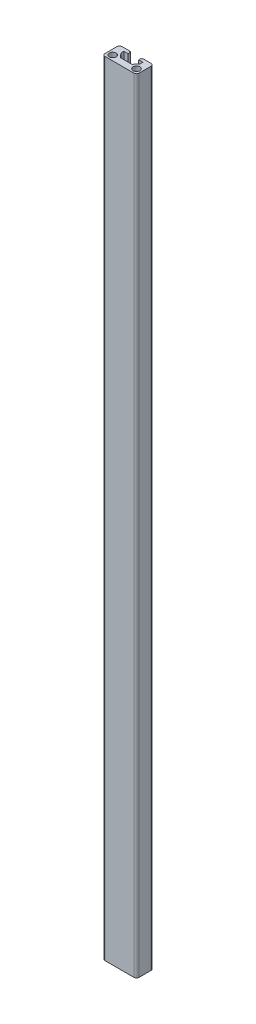
ISO-10303-21;
HEADER;
FILE_DESCRIPTION(('STEP AP214'),'2;1');
FILE_NAME('part.step','',(''),(''),'','','');
FILE_SCHEMA(('AUTOMOTIVE_DESIGN { 1 0 10303 214 1 1 1 1 }'));
ENDSEC;
DATA;
#1=APPLICATION_CONTEXT('core data for automotive mechanical design processes');
#2=APPLICATION_PROTOCOL_DEFINITION('international standard','automotive_design',2000,#1);
#3=PRODUCT_CONTEXT('',#1,'mechanical');
#4=PRODUCT('Part','Part','',(#3));
#5=PRODUCT_RELATED_PRODUCT_CATEGORY('part','',(#4));
#6=PRODUCT_DEFINITION_FORMATION('','',#4);
#7=PRODUCT_DEFINITION_CONTEXT('part definition',#1,'design');
#8=PRODUCT_DEFINITION('design','',#6,#7);
#9=PRODUCT_DEFINITION_SHAPE('','',#8);
#10=(LENGTH_UNIT() NAMED_UNIT(*) SI_UNIT(.MILLI.,.METRE.));
#11=(NAMED_UNIT(*) PLANE_ANGLE_UNIT() SI_UNIT($,.RADIAN.));
#12=(NAMED_UNIT(*) SI_UNIT($,.STERADIAN.) SOLID_ANGLE_UNIT());
#13=UNCERTAINTY_MEASURE_WITH_UNIT(LENGTH_MEASURE(1.E-05),#10,'distance_accuracy_value','');
#14=(GEOMETRIC_REPRESENTATION_CONTEXT(3) GLOBAL_UNCERTAINTY_ASSIGNED_CONTEXT((#13)) GLOBAL_UNIT_ASSIGNED_CONTEXT((#10,
#11,#12)) REPRESENTATION_CONTEXT('',''));
#15=CARTESIAN_POINT('',(0.,0.,0.));
#16=DIRECTION('',(0.,0.,1.));
#17=DIRECTION('',(1.,0.,0.));
#18=AXIS2_PLACEMENT_3D('',#15,#16,#17);
#19=CARTESIAN_POINT('',(0.,460.,0.));
#20=DIRECTION('',(0.,1.,0.));
#21=DIRECTION('',(0.,0.,1.));
#22=AXIS2_PLACEMENT_3D('',#19,#20,#21);
#23=PLANE('',#22);
#24=CARTESIAN_POINT('',(17.,460.,-3.));
#25=DIRECTION('',(0.,1.,0.));
#26=DIRECTION('',(0.,0.,1.));
#27=AXIS2_PLACEMENT_3D('',#24,#25,#26);
#28=CIRCLE('',#27,2.);
#29=CARTESIAN_POINT('',(17.,460.,-0.999999999999997));
#30=VERTEX_POINT('',#29);
#31=EDGE_CURVE('E262',#30,#30,#28,.T.);
#32=ORIENTED_EDGE('',*,*,#31,.F.);
#33=EDGE_LOOP('',(#32));
#34=FACE_BOUND('',#33,.T.);
#35=DIRECTION('',(-1.,0.,0.));
#36=VECTOR('',#35,1.);
#37=CARTESIAN_POINT('',(6.35,460.,-10.));
#38=LINE('',#37,#36);
#39=CARTESIAN_POINT('',(6.35,460.,-10.));
#40=VERTEX_POINT('',#39);
#41=CARTESIAN_POINT('',(1.5,460.,-10.));
#42=VERTEX_POINT('',#41);
#43=EDGE_CURVE('E253',#40,#42,#38,.T.);
#44=ORIENTED_EDGE('',*,*,#43,.T.);
#45=CARTESIAN_POINT('',(1.5,460.,-8.5));
#46=DIRECTION('',(0.,1.,0.));
#47=DIRECTION('',(0.,0.,1.));
#48=AXIS2_PLACEMENT_3D('',#45,#46,#47);
#49=CIRCLE('',#48,1.5);
#50=CARTESIAN_POINT('',(0.,460.,-8.5));
#51=VERTEX_POINT('',#50);
#52=EDGE_CURVE('E393',#42,#51,#49,.T.);
#53=ORIENTED_EDGE('',*,*,#52,.T.);
#54=DIRECTION('',(0.,0.,1.));
#55=VECTOR('',#54,1.);
#56=CARTESIAN_POINT('',(0.,460.,-10.));
#57=LINE('',#56,#55);
#58=CARTESIAN_POINT('',(0.,460.,-1.5));
#59=VERTEX_POINT('',#58);
#60=EDGE_CURVE('E314',#51,#59,#57,.T.);
#61=ORIENTED_EDGE('',*,*,#60,.T.);
#62=CARTESIAN_POINT('',(1.5,460.,-1.5));
#63=DIRECTION('',(0.,1.,0.));
#64=DIRECTION('',(0.,0.,1.));
#65=AXIS2_PLACEMENT_3D('',#62,#63,#64);
#66=CIRCLE('',#65,1.5);
#67=CARTESIAN_POINT('',(1.5,460.,0.));
#68=VERTEX_POINT('',#67);
#69=EDGE_CURVE('E390',#59,#68,#66,.T.);
#70=ORIENTED_EDGE('',*,*,#69,.T.);
#71=DIRECTION('',(1.,0.,0.));
#72=VECTOR('',#71,1.);
#73=CARTESIAN_POINT('',(0.,460.,0.));
#74=LINE('',#73,#72);
#75=CARTESIAN_POINT('',(18.5,460.,0.));
#76=VERTEX_POINT('',#75);
#77=EDGE_CURVE('E522',#68,#76,#74,.T.);
#78=ORIENTED_EDGE('',*,*,#77,.T.);
#79=CARTESIAN_POINT('',(18.5,460.,-1.5));
#80=DIRECTION('',(0.,1.,0.));
#81=DIRECTION('',(0.,0.,1.));
#82=AXIS2_PLACEMENT_3D('',#79,#80,#81);
#83=CIRCLE('',#82,1.5);
#84=CARTESIAN_POINT('',(20.,460.,-1.5));
#85=VERTEX_POINT('',#84);
#86=EDGE_CURVE('E385',#76,#85,#83,.T.);
#87=ORIENTED_EDGE('',*,*,#86,.T.);
#88=DIRECTION('',(0.,0.,-1.));
#89=VECTOR('',#88,1.);
#90=CARTESIAN_POINT('',(20.,460.,0.));
#91=LINE('',#90,#89);
#92=CARTESIAN_POINT('',(20.,460.,-8.5));
#93=VERTEX_POINT('',#92);
#94=EDGE_CURVE('E197',#85,#93,#91,.T.);
#95=ORIENTED_EDGE('',*,*,#94,.T.);
#96=CARTESIAN_POINT('',(18.5,460.,-8.5));
#97=DIRECTION('',(0.,1.,0.));
#98=DIRECTION('',(0.,0.,1.));
#99=AXIS2_PLACEMENT_3D('',#96,#97,#98);
#100=CIRCLE('',#99,1.5);
#101=CARTESIAN_POINT('',(18.5,460.,-10.));
#102=VERTEX_POINT('',#101);
#103=EDGE_CURVE('E55',#93,#102,#100,.T.);
#104=ORIENTED_EDGE('',*,*,#103,.T.);
#105=DIRECTION('',(-1.,0.,0.));
#106=VECTOR('',#105,1.);
#107=CARTESIAN_POINT('',(20.,460.,-10.));
#108=LINE('',#107,#106);
#109=CARTESIAN_POINT('',(13.65,460.,-10.));
#110=VERTEX_POINT('',#109);
#111=EDGE_CURVE('E186',#102,#110,#108,.T.);
#112=ORIENTED_EDGE('',*,*,#111,.T.);
#113=DIRECTION('',(0.,0.,1.));
#114=VECTOR('',#113,1.);
#115=CARTESIAN_POINT('',(13.65,460.,-9.51042760217637));
#116=LINE('',#115,#114);
#117=CARTESIAN_POINT('',(13.65,460.,-9.51042760217637));
#118=VERTEX_POINT('',#117);
#119=EDGE_CURVE('E191',#110,#118,#116,.T.);
#120=ORIENTED_EDGE('',*,*,#119,.T.);
#121=DIRECTION('',(-1.,0.,0.));
#122=VECTOR('',#121,1.);
#123=CARTESIAN_POINT('',(13.1,460.,-9.51042760217637));
#124=LINE('',#123,#122);
#125=CARTESIAN_POINT('',(13.1,460.,-9.51042760217637));
#126=VERTEX_POINT('',#125);
#127=EDGE_CURVE('E214',#118,#126,#124,.T.);
#128=ORIENTED_EDGE('',*,*,#127,.T.);
#129=DIRECTION('',(0.,0.,1.));
#130=VECTOR('',#129,1.);
#131=CARTESIAN_POINT('',(13.1,460.,-8.2));
#132=LINE('',#131,#130);
#133=CARTESIAN_POINT('',(13.1,460.,-8.2));
#134=VERTEX_POINT('',#133);
#135=EDGE_CURVE('E217',#126,#134,#132,.T.);
#136=ORIENTED_EDGE('',*,*,#135,.T.);
#137=DIRECTION('',(1.,0.,0.));
#138=VECTOR('',#137,1.);
#139=CARTESIAN_POINT('',(15.6,460.,-8.2));
#140=LINE('',#139,#138);
#141=CARTESIAN_POINT('',(15.6,460.,-8.2));
#142=VERTEX_POINT('',#141);
#143=EDGE_CURVE('E223',#134,#142,#140,.T.);
#144=ORIENTED_EDGE('',*,*,#143,.T.);
#145=DIRECTION('',(0.,0.,1.));
#146=VECTOR('',#145,1.);
#147=CARTESIAN_POINT('',(15.6,460.,-6.44750713590306));
#148=LINE('',#147,#146);
#149=CARTESIAN_POINT('',(15.6,460.,-6.44750713590306));
#150=VERTEX_POINT('',#149);
#151=EDGE_CURVE('E226',#142,#150,#148,.T.);
#152=ORIENTED_EDGE('',*,*,#151,.T.);
#153=DIRECTION('',(-0.651429062487269,0.,0.758709546893248));
#154=VECTOR('',#153,1.);
#155=CARTESIAN_POINT('',(13.4127068625717,460.,-3.9));
#156=LINE('',#155,#154);
#157=CARTESIAN_POINT('',(13.4127068625717,460.,-3.9));
#158=VERTEX_POINT('',#157);
#159=EDGE_CURVE('E229',#150,#158,#156,.T.);
#160=ORIENTED_EDGE('',*,*,#159,.T.);
#161=DIRECTION('',(-1.,0.,0.));
#162=VECTOR('',#161,1.);
#163=CARTESIAN_POINT('',(6.58729313742833,460.,-3.9));
#164=LINE('',#163,#162);
#165=CARTESIAN_POINT('',(6.58729313742833,460.,-3.9));
#166=VERTEX_POINT('',#165);
#167=EDGE_CURVE('E232',#158,#166,#164,.T.);
#168=ORIENTED_EDGE('',*,*,#167,.T.);
#169=DIRECTION('',(-0.651429062487269,0.,-0.758709546893248));
#170=VECTOR('',#169,1.);
#171=CARTESIAN_POINT('',(4.4,460.,-6.44750713590306));
#172=LINE('',#171,#170);
#173=CARTESIAN_POINT('',(4.4,460.,-6.44750713590306));
#174=VERTEX_POINT('',#173);
#175=EDGE_CURVE('E235',#166,#174,#172,.T.);
#176=ORIENTED_EDGE('',*,*,#175,.T.);
#177=DIRECTION('',(0.,0.,-1.));
#178=VECTOR('',#177,1.);
#179=CARTESIAN_POINT('',(4.4,460.,-8.2));
#180=LINE('',#179,#178);
#181=CARTESIAN_POINT('',(4.4,460.,-8.2));
#182=VERTEX_POINT('',#181);
#183=EDGE_CURVE('E238',#174,#182,#180,.T.);
#184=ORIENTED_EDGE('',*,*,#183,.T.);
#185=DIRECTION('',(1.,0.,0.));
#186=VECTOR('',#185,1.);
#187=CARTESIAN_POINT('',(6.9,460.,-8.2));
#188=LINE('',#187,#186);
#189=CARTESIAN_POINT('',(6.9,460.,-8.2));
#190=VERTEX_POINT('',#189);
#191=EDGE_CURVE('E241',#182,#190,#188,.T.);
#192=ORIENTED_EDGE('',*,*,#191,.T.);
#193=DIRECTION('',(0.,0.,-1.));
#194=VECTOR('',#193,1.);
#195=CARTESIAN_POINT('',(6.9,460.,-9.51042760217637));
#196=LINE('',#195,#194);
#197=CARTESIAN_POINT('',(6.9,460.,-9.51042760217637));
#198=VERTEX_POINT('',#197);
#199=EDGE_CURVE('E244',#190,#198,#196,.T.);
#200=ORIENTED_EDGE('',*,*,#199,.T.);
#201=DIRECTION('',(-1.,0.,0.));
#202=VECTOR('',#201,1.);
#203=CARTESIAN_POINT('',(6.35,460.,-9.51042760217637));
#204=LINE('',#203,#202);
#205=CARTESIAN_POINT('',(6.35,460.,-9.51042760217637));
#206=VERTEX_POINT('',#205);
#207=EDGE_CURVE('E247',#198,#206,#204,.T.);
#208=ORIENTED_EDGE('',*,*,#207,.T.);
#209=DIRECTION('',(0.,0.,-1.));
#210=VECTOR('',#209,1.);
#211=CARTESIAN_POINT('',(6.35,460.,-10.));
#212=LINE('',#211,#210);
#213=EDGE_CURVE('E250',#206,#40,#212,.T.);
#214=ORIENTED_EDGE('',*,*,#213,.T.);
#215=EDGE_LOOP('',(#44,#53,#61,#70,#78,#87,#95,#104,#112,#120,#128,#136,#144,#152,#160,#168,
#176,#184,#192,#200,#208,#214));
#216=FACE_BOUND('',#215,.T.);
#217=CARTESIAN_POINT('',(3.,460.,-3.));
#218=DIRECTION('',(0.,1.,0.));
#219=DIRECTION('',(0.,0.,1.));
#220=AXIS2_PLACEMENT_3D('',#217,#218,#219);
#221=CIRCLE('',#220,2.);
#222=CARTESIAN_POINT('',(3.,460.,-1.));
#223=VERTEX_POINT('',#222);
#224=EDGE_CURVE('E572',#223,#223,#221,.T.);
#225=ORIENTED_EDGE('',*,*,#224,.F.);
#226=EDGE_LOOP('',(#225));
#227=FACE_BOUND('',#226,.T.);
#228=ADVANCED_FACE('F39',(#34,#216,#227),#23,.T.);
#229=CARTESIAN_POINT('',(0.,0.,0.));
#230=DIRECTION('',(0.,1.,0.));
#231=DIRECTION('',(0.,0.,1.));
#232=AXIS2_PLACEMENT_3D('',#229,#230,#231);
#233=PLANE('',#232);
#234=DIRECTION('',(0.,0.,1.));
#235=VECTOR('',#234,1.);
#236=CARTESIAN_POINT('',(0.,0.,-10.));
#237=LINE('',#236,#235);
#238=CARTESIAN_POINT('',(0.,0.,-8.5));
#239=VERTEX_POINT('',#238);
#240=CARTESIAN_POINT('',(0.,0.,-1.5));
#241=VERTEX_POINT('',#240);
#242=EDGE_CURVE('E257',#239,#241,#237,.T.);
#243=ORIENTED_EDGE('',*,*,#242,.F.);
#244=CARTESIAN_POINT('',(1.5,0.,-8.5));
#245=DIRECTION('',(0.,1.,0.));
#246=DIRECTION('',(0.,0.,1.));
#247=AXIS2_PLACEMENT_3D('',#244,#245,#246);
#248=CIRCLE('',#247,1.5);
#249=CARTESIAN_POINT('',(1.5,0.,-10.));
#250=VERTEX_POINT('',#249);
#251=EDGE_CURVE('E379',#239,#250,#248,.F.);
#252=ORIENTED_EDGE('',*,*,#251,.T.);
#253=DIRECTION('',(-1.,0.,0.));
#254=VECTOR('',#253,1.);
#255=CARTESIAN_POINT('',(6.35,0.,-10.));
#256=LINE('',#255,#254);
#257=CARTESIAN_POINT('',(6.35,0.,-10.));
#258=VERTEX_POINT('',#257);
#259=EDGE_CURVE('E310',#258,#250,#256,.T.);
#260=ORIENTED_EDGE('',*,*,#259,.F.);
#261=DIRECTION('',(0.,0.,-1.));
#262=VECTOR('',#261,1.);
#263=CARTESIAN_POINT('',(6.35,0.,-10.));
#264=LINE('',#263,#262);
#265=CARTESIAN_POINT('',(6.35,0.,-9.51042760217637));
#266=VERTEX_POINT('',#265);
#267=EDGE_CURVE('E307',#266,#258,#264,.T.);
#268=ORIENTED_EDGE('',*,*,#267,.F.);
#269=DIRECTION('',(-1.,0.,0.));
#270=VECTOR('',#269,1.);
#271=CARTESIAN_POINT('',(6.35,0.,-9.51042760217637));
#272=LINE('',#271,#270);
#273=CARTESIAN_POINT('',(6.9,0.,-9.51042760217637));
#274=VERTEX_POINT('',#273);
#275=EDGE_CURVE('E304',#274,#266,#272,.T.);
#276=ORIENTED_EDGE('',*,*,#275,.F.);
#277=DIRECTION('',(0.,0.,-1.));
#278=VECTOR('',#277,1.);
#279=CARTESIAN_POINT('',(6.9,0.,-9.51042760217637));
#280=LINE('',#279,#278);
#281=CARTESIAN_POINT('',(6.9,0.,-8.2));
#282=VERTEX_POINT('',#281);
#283=EDGE_CURVE('E301',#282,#274,#280,.T.);
#284=ORIENTED_EDGE('',*,*,#283,.F.);
#285=DIRECTION('',(1.,0.,0.));
#286=VECTOR('',#285,1.);
#287=CARTESIAN_POINT('',(6.9,0.,-8.2));
#288=LINE('',#287,#286);
#289=CARTESIAN_POINT('',(4.4,0.,-8.2));
#290=VERTEX_POINT('',#289);
#291=EDGE_CURVE('E298',#290,#282,#288,.T.);
#292=ORIENTED_EDGE('',*,*,#291,.F.);
#293=DIRECTION('',(0.,0.,-1.));
#294=VECTOR('',#293,1.);
#295=CARTESIAN_POINT('',(4.4,0.,-8.2));
#296=LINE('',#295,#294);
#297=CARTESIAN_POINT('',(4.4,0.,-6.44750713590306));
#298=VERTEX_POINT('',#297);
#299=EDGE_CURVE('E295',#298,#290,#296,.T.);
#300=ORIENTED_EDGE('',*,*,#299,.F.);
#301=DIRECTION('',(-0.651429062487269,0.,-0.758709546893248));
#302=VECTOR('',#301,1.);
#303=CARTESIAN_POINT('',(4.4,0.,-6.44750713590306));
#304=LINE('',#303,#302);
#305=CARTESIAN_POINT('',(6.58729313742833,0.,-3.9));
#306=VERTEX_POINT('',#305);
#307=EDGE_CURVE('E292',#306,#298,#304,.T.);
#308=ORIENTED_EDGE('',*,*,#307,.F.);
#309=DIRECTION('',(-1.,0.,0.));
#310=VECTOR('',#309,1.);
#311=CARTESIAN_POINT('',(6.58729313742833,0.,-3.9));
#312=LINE('',#311,#310);
#313=CARTESIAN_POINT('',(13.4127068625717,0.,-3.9));
#314=VERTEX_POINT('',#313);
#315=EDGE_CURVE('E289',#314,#306,#312,.T.);
#316=ORIENTED_EDGE('',*,*,#315,.F.);
#317=DIRECTION('',(-0.651429062487269,0.,0.758709546893248));
#318=VECTOR('',#317,1.);
#319=CARTESIAN_POINT('',(13.4127068625717,0.,-3.9));
#320=LINE('',#319,#318);
#321=CARTESIAN_POINT('',(15.6,0.,-6.44750713590306));
#322=VERTEX_POINT('',#321);
#323=EDGE_CURVE('E286',#322,#314,#320,.T.);
#324=ORIENTED_EDGE('',*,*,#323,.F.);
#325=DIRECTION('',(0.,0.,1.));
#326=VECTOR('',#325,1.);
#327=CARTESIAN_POINT('',(15.6,0.,-6.44750713590306));
#328=LINE('',#327,#326);
#329=CARTESIAN_POINT('',(15.6,0.,-8.2));
#330=VERTEX_POINT('',#329);
#331=EDGE_CURVE('E283',#330,#322,#328,.T.);
#332=ORIENTED_EDGE('',*,*,#331,.F.);
#333=DIRECTION('',(1.,0.,0.));
#334=VECTOR('',#333,1.);
#335=CARTESIAN_POINT('',(15.6,0.,-8.2));
#336=LINE('',#335,#334);
#337=CARTESIAN_POINT('',(13.1,0.,-8.2));
#338=VERTEX_POINT('',#337);
#339=EDGE_CURVE('E280',#338,#330,#336,.T.);
#340=ORIENTED_EDGE('',*,*,#339,.F.);
#341=DIRECTION('',(0.,0.,1.));
#342=VECTOR('',#341,1.);
#343=CARTESIAN_POINT('',(13.1,0.,-8.2));
#344=LINE('',#343,#342);
#345=CARTESIAN_POINT('',(13.1,0.,-9.51042760217637));
#346=VERTEX_POINT('',#345);
#347=EDGE_CURVE('E277',#346,#338,#344,.T.);
#348=ORIENTED_EDGE('',*,*,#347,.F.);
#349=DIRECTION('',(-1.,0.,0.));
#350=VECTOR('',#349,1.);
#351=CARTESIAN_POINT('',(13.1,0.,-9.51042760217637));
#352=LINE('',#351,#350);
#353=CARTESIAN_POINT('',(13.65,0.,-9.51042760217637));
#354=VERTEX_POINT('',#353);
#355=EDGE_CURVE('E274',#354,#346,#352,.T.);
#356=ORIENTED_EDGE('',*,*,#355,.F.);
#357=DIRECTION('',(0.,0.,1.));
#358=VECTOR('',#357,1.);
#359=CARTESIAN_POINT('',(13.65,0.,-9.51042760217637));
#360=LINE('',#359,#358);
#361=CARTESIAN_POINT('',(13.65,0.,-10.));
#362=VERTEX_POINT('',#361);
#363=EDGE_CURVE('E271',#362,#354,#360,.T.);
#364=ORIENTED_EDGE('',*,*,#363,.F.);
#365=DIRECTION('',(-1.,0.,0.));
#366=VECTOR('',#365,1.);
#367=CARTESIAN_POINT('',(20.,0.,-10.));
#368=LINE('',#367,#366);
#369=CARTESIAN_POINT('',(18.5,0.,-10.));
#370=VERTEX_POINT('',#369);
#371=EDGE_CURVE('E203',#370,#362,#368,.T.);
#372=ORIENTED_EDGE('',*,*,#371,.F.);
#373=CARTESIAN_POINT('',(18.5,0.,-8.5));
#374=DIRECTION('',(0.,1.,0.));
#375=DIRECTION('',(0.,0.,1.));
#376=AXIS2_PLACEMENT_3D('',#373,#374,#375);
#377=CIRCLE('',#376,1.5);
#378=CARTESIAN_POINT('',(20.,0.,-8.5));
#379=VERTEX_POINT('',#378);
#380=EDGE_CURVE('E373',#370,#379,#377,.F.);
#381=ORIENTED_EDGE('',*,*,#380,.T.);
#382=DIRECTION('',(0.,0.,-1.));
#383=VECTOR('',#382,1.);
#384=CARTESIAN_POINT('',(20.,0.,0.));
#385=LINE('',#384,#383);
#386=CARTESIAN_POINT('',(20.,0.,-1.5));
#387=VERTEX_POINT('',#386);
#388=EDGE_CURVE('E266',#387,#379,#385,.T.);
#389=ORIENTED_EDGE('',*,*,#388,.F.);
#390=CARTESIAN_POINT('',(18.5,0.,-1.5));
#391=DIRECTION('',(0.,1.,0.));
#392=DIRECTION('',(0.,0.,1.));
#393=AXIS2_PLACEMENT_3D('',#390,#391,#392);
#394=CIRCLE('',#393,1.5);
#395=CARTESIAN_POINT('',(18.5,0.,0.));
#396=VERTEX_POINT('',#395);
#397=EDGE_CURVE('E370',#387,#396,#394,.F.);
#398=ORIENTED_EDGE('',*,*,#397,.T.);
#399=DIRECTION('',(1.,0.,0.));
#400=VECTOR('',#399,1.);
#401=CARTESIAN_POINT('',(0.,0.,0.));
#402=LINE('',#401,#400);
#403=CARTESIAN_POINT('',(1.5,0.,0.));
#404=VERTEX_POINT('',#403);
#405=EDGE_CURVE('E261',#404,#396,#402,.T.);
#406=ORIENTED_EDGE('',*,*,#405,.F.);
#407=CARTESIAN_POINT('',(1.5,0.,-1.5));
#408=DIRECTION('',(0.,1.,0.));
#409=DIRECTION('',(0.,0.,1.));
#410=AXIS2_PLACEMENT_3D('',#407,#408,#409);
#411=CIRCLE('',#410,1.5);
#412=EDGE_CURVE('E376',#404,#241,#411,.F.);
#413=ORIENTED_EDGE('',*,*,#412,.T.);
#414=EDGE_LOOP('',(#243,#252,#260,#268,#276,#284,#292,#300,#308,#316,#324,#332,#340,#348,#356,
#364,#372,#381,#389,#398,#406,#413));
#415=FACE_BOUND('',#414,.T.);
#416=CARTESIAN_POINT('',(17.,0.,-3.));
#417=DIRECTION('',(0.,1.,0.));
#418=DIRECTION('',(0.,0.,1.));
#419=AXIS2_PLACEMENT_3D('',#416,#417,#418);
#420=CIRCLE('',#419,2.);
#421=CARTESIAN_POINT('',(17.,0.,-0.999999999999997));
#422=VERTEX_POINT('',#421);
#423=EDGE_CURVE('E528',#422,#422,#420,.T.);
#424=ORIENTED_EDGE('',*,*,#423,.T.);
#425=EDGE_LOOP('',(#424));
#426=FACE_BOUND('',#425,.T.);
#427=CARTESIAN_POINT('',(3.,0.,-3.));
#428=DIRECTION('',(0.,1.,0.));
#429=DIRECTION('',(0.,0.,1.));
#430=AXIS2_PLACEMENT_3D('',#427,#428,#429);
#431=CIRCLE('',#430,2.);
#432=CARTESIAN_POINT('',(3.,0.,-1.));
#433=VERTEX_POINT('',#432);
#434=EDGE_CURVE('E576',#433,#433,#431,.T.);
#435=ORIENTED_EDGE('',*,*,#434,.T.);
#436=EDGE_LOOP('',(#435));
#437=FACE_BOUND('',#436,.T.);
#438=ADVANCED_FACE('F414',(#415,#426,#437),#233,.F.);
#439=CARTESIAN_POINT('',(0.,460.,-10.));
#440=DIRECTION('',(1.,0.,0.));
#441=DIRECTION('',(0.,0.,-1.));
#442=AXIS2_PLACEMENT_3D('',#439,#440,#441);
#443=PLANE('',#442);
#444=ORIENTED_EDGE('',*,*,#60,.F.);
#445=DIRECTION('',(0.,-1.,0.));
#446=VECTOR('',#445,1.);
#447=CARTESIAN_POINT('',(0.,460.,-8.5));
#448=LINE('',#447,#446);
#449=EDGE_CURVE('E366',#51,#239,#448,.T.);
#450=ORIENTED_EDGE('',*,*,#449,.T.);
#451=ORIENTED_EDGE('',*,*,#242,.T.);
#452=DIRECTION('',(0.,-1.,0.));
#453=VECTOR('',#452,1.);
#454=CARTESIAN_POINT('',(0.,460.,-1.5));
#455=LINE('',#454,#453);
#456=EDGE_CURVE('E207',#241,#59,#455,.F.);
#457=ORIENTED_EDGE('',*,*,#456,.T.);
#458=EDGE_LOOP('',(#444,#450,#451,#457));
#459=FACE_BOUND('',#458,.T.);
#460=ADVANCED_FACE('F434',(#459),#443,.F.);
#461=CARTESIAN_POINT('',(0.,460.,0.));
#462=DIRECTION('',(0.,0.,-1.));
#463=DIRECTION('',(-1.,0.,0.));
#464=AXIS2_PLACEMENT_3D('',#461,#462,#463);
#465=PLANE('',#464);
#466=ORIENTED_EDGE('',*,*,#77,.F.);
#467=DIRECTION('',(0.,-1.,0.));
#468=VECTOR('',#467,1.);
#469=CARTESIAN_POINT('',(1.5,460.,0.));
#470=LINE('',#469,#468);
#471=EDGE_CURVE('E399',#68,#404,#470,.T.);
#472=ORIENTED_EDGE('',*,*,#471,.T.);
#473=ORIENTED_EDGE('',*,*,#405,.T.);
#474=DIRECTION('',(0.,-1.,0.));
#475=VECTOR('',#474,1.);
#476=CARTESIAN_POINT('',(18.5,460.,0.));
#477=LINE('',#476,#475);
#478=EDGE_CURVE('E396',#396,#76,#477,.F.);
#479=ORIENTED_EDGE('',*,*,#478,.T.);
#480=EDGE_LOOP('',(#466,#472,#473,#479));
#481=FACE_BOUND('',#480,.T.);
#482=ADVANCED_FACE('F499',(#481),#465,.F.);
#483=CARTESIAN_POINT('',(20.,460.,0.));
#484=DIRECTION('',(-1.,0.,0.));
#485=DIRECTION('',(0.,0.,1.));
#486=AXIS2_PLACEMENT_3D('',#483,#484,#485);
#487=PLANE('',#486);
#488=ORIENTED_EDGE('',*,*,#388,.T.);
#489=DIRECTION('',(0.,-1.,0.));
#490=VECTOR('',#489,1.);
#491=CARTESIAN_POINT('',(20.,460.,-8.5));
#492=LINE('',#491,#490);
#493=EDGE_CURVE('E11',#379,#93,#492,.F.);
#494=ORIENTED_EDGE('',*,*,#493,.T.);
#495=ORIENTED_EDGE('',*,*,#94,.F.);
#496=DIRECTION('',(0.,-1.,0.));
#497=VECTOR('',#496,1.);
#498=CARTESIAN_POINT('',(20.,460.,-1.5));
#499=LINE('',#498,#497);
#500=EDGE_CURVE('E48',#85,#387,#499,.T.);
#501=ORIENTED_EDGE('',*,*,#500,.T.);
#502=EDGE_LOOP('',(#488,#494,#495,#501));
#503=FACE_BOUND('',#502,.T.);
#504=ADVANCED_FACE('F409',(#503),#487,.F.);
#505=CARTESIAN_POINT('',(20.,460.,-10.));
#506=DIRECTION('',(0.,0.,1.));
#507=DIRECTION('',(1.,0.,0.));
#508=AXIS2_PLACEMENT_3D('',#505,#506,#507);
#509=PLANE('',#508);
#510=ORIENTED_EDGE('',*,*,#111,.F.);
#511=DIRECTION('',(0.,-1.,0.));
#512=VECTOR('',#511,1.);
#513=CARTESIAN_POINT('',(18.5,460.,-10.));
#514=LINE('',#513,#512);
#515=EDGE_CURVE('E403',#102,#370,#514,.T.);
#516=ORIENTED_EDGE('',*,*,#515,.T.);
#517=ORIENTED_EDGE('',*,*,#371,.T.);
#518=DIRECTION('',(0.,-1.,0.));
#519=VECTOR('',#518,1.);
#520=CARTESIAN_POINT('',(13.65,460.,-10.));
#521=LINE('',#520,#519);
#522=EDGE_CURVE('E200',#110,#362,#521,.T.);
#523=ORIENTED_EDGE('',*,*,#522,.F.);
#524=EDGE_LOOP('',(#510,#516,#517,#523));
#525=FACE_BOUND('',#524,.T.);
#526=ADVANCED_FACE('F201',(#525),#509,.F.);
#527=CARTESIAN_POINT('',(13.65,460.,-9.51042760217637));
#528=DIRECTION('',(1.,0.,0.));
#529=DIRECTION('',(0.,0.,-1.));
#530=AXIS2_PLACEMENT_3D('',#527,#528,#529);
#531=PLANE('',#530);
#532=ORIENTED_EDGE('',*,*,#363,.T.);
#533=DIRECTION('',(0.,-1.,0.));
#534=VECTOR('',#533,1.);
#535=CARTESIAN_POINT('',(13.65,460.,-9.51042760217637));
#536=LINE('',#535,#534);
#537=EDGE_CURVE('E208',#118,#354,#536,.T.);
#538=ORIENTED_EDGE('',*,*,#537,.F.);
#539=ORIENTED_EDGE('',*,*,#119,.F.);
#540=ORIENTED_EDGE('',*,*,#522,.T.);
#541=EDGE_LOOP('',(#532,#538,#539,#540));
#542=FACE_BOUND('',#541,.T.);
#543=ADVANCED_FACE('F210',(#542),#531,.F.);
#544=CARTESIAN_POINT('',(13.1,460.,-9.51042760217637));
#545=DIRECTION('',(0.,0.,1.));
#546=DIRECTION('',(1.,0.,0.));
#547=AXIS2_PLACEMENT_3D('',#544,#545,#546);
#548=PLANE('',#547);
#549=ORIENTED_EDGE('',*,*,#355,.T.);
#550=DIRECTION('',(0.,-1.,0.));
#551=VECTOR('',#550,1.);
#552=CARTESIAN_POINT('',(13.1,460.,-9.51042760217637));
#553=LINE('',#552,#551);
#554=EDGE_CURVE('E358',#126,#346,#553,.T.);
#555=ORIENTED_EDGE('',*,*,#554,.F.);
#556=ORIENTED_EDGE('',*,*,#127,.F.);
#557=ORIENTED_EDGE('',*,*,#537,.T.);
#558=EDGE_LOOP('',(#549,#555,#556,#557));
#559=FACE_BOUND('',#558,.T.);
#560=ADVANCED_FACE('F488',(#559),#548,.F.);
#561=CARTESIAN_POINT('',(13.1,460.,-8.2));
#562=DIRECTION('',(1.,0.,0.));
#563=DIRECTION('',(0.,0.,-1.));
#564=AXIS2_PLACEMENT_3D('',#561,#562,#563);
#565=PLANE('',#564);
#566=ORIENTED_EDGE('',*,*,#347,.T.);
#567=DIRECTION('',(0.,-1.,0.));
#568=VECTOR('',#567,1.);
#569=CARTESIAN_POINT('',(13.1,460.,-8.2));
#570=LINE('',#569,#568);
#571=EDGE_CURVE('E354',#134,#338,#570,.T.);
#572=ORIENTED_EDGE('',*,*,#571,.F.);
#573=ORIENTED_EDGE('',*,*,#135,.F.);
#574=ORIENTED_EDGE('',*,*,#554,.T.);
#575=EDGE_LOOP('',(#566,#572,#573,#574));
#576=FACE_BOUND('',#575,.T.);
#577=ADVANCED_FACE('F484',(#576),#565,.F.);
#578=CARTESIAN_POINT('',(15.6,460.,-8.2));
#579=DIRECTION('',(0.,0.,-1.));
#580=DIRECTION('',(-1.,0.,0.));
#581=AXIS2_PLACEMENT_3D('',#578,#579,#580);
#582=PLANE('',#581);
#583=ORIENTED_EDGE('',*,*,#339,.T.);
#584=DIRECTION('',(0.,-1.,0.));
#585=VECTOR('',#584,1.);
#586=CARTESIAN_POINT('',(15.6,460.,-8.2));
#587=LINE('',#586,#585);
#588=EDGE_CURVE('E350',#142,#330,#587,.T.);
#589=ORIENTED_EDGE('',*,*,#588,.F.);
#590=ORIENTED_EDGE('',*,*,#143,.F.);
#591=ORIENTED_EDGE('',*,*,#571,.T.);
#592=EDGE_LOOP('',(#583,#589,#590,#591));
#593=FACE_BOUND('',#592,.T.);
#594=ADVANCED_FACE('F480',(#593),#582,.F.);
#595=CARTESIAN_POINT('',(15.6,460.,-6.44750713590306));
#596=DIRECTION('',(1.,0.,0.));
#597=DIRECTION('',(0.,0.,-1.));
#598=AXIS2_PLACEMENT_3D('',#595,#596,#597);
#599=PLANE('',#598);
#600=ORIENTED_EDGE('',*,*,#331,.T.);
#601=DIRECTION('',(0.,-1.,0.));
#602=VECTOR('',#601,1.);
#603=CARTESIAN_POINT('',(15.6,460.,-6.44750713590306));
#604=LINE('',#603,#602);
#605=EDGE_CURVE('E346',#150,#322,#604,.T.);
#606=ORIENTED_EDGE('',*,*,#605,.F.);
#607=ORIENTED_EDGE('',*,*,#151,.F.);
#608=ORIENTED_EDGE('',*,*,#588,.T.);
#609=EDGE_LOOP('',(#600,#606,#607,#608));
#610=FACE_BOUND('',#609,.T.);
#611=ADVANCED_FACE('F476',(#610),#599,.F.);
#612=CARTESIAN_POINT('',(13.4127068625717,460.,-3.9));
#613=DIRECTION('',(0.758709546893248,0.,0.651429062487269));
#614=DIRECTION('',(0.651429062487269,0.,-0.758709546893248));
#615=AXIS2_PLACEMENT_3D('',#612,#613,#614);
#616=PLANE('',#615);
#617=ORIENTED_EDGE('',*,*,#323,.T.);
#618=DIRECTION('',(0.,-1.,0.));
#619=VECTOR('',#618,1.);
#620=CARTESIAN_POINT('',(13.4127068625717,460.,-3.9));
#621=LINE('',#620,#619);
#622=EDGE_CURVE('E342',#158,#314,#621,.T.);
#623=ORIENTED_EDGE('',*,*,#622,.F.);
#624=ORIENTED_EDGE('',*,*,#159,.F.);
#625=ORIENTED_EDGE('',*,*,#605,.T.);
#626=EDGE_LOOP('',(#617,#623,#624,#625));
#627=FACE_BOUND('',#626,.T.);
#628=ADVANCED_FACE('F472',(#627),#616,.F.);
#629=CARTESIAN_POINT('',(6.58729313742833,460.,-3.9));
#630=DIRECTION('',(0.,0.,1.));
#631=DIRECTION('',(1.,0.,0.));
#632=AXIS2_PLACEMENT_3D('',#629,#630,#631);
#633=PLANE('',#632);
#634=ORIENTED_EDGE('',*,*,#315,.T.);
#635=DIRECTION('',(0.,-1.,0.));
#636=VECTOR('',#635,1.);
#637=CARTESIAN_POINT('',(6.58729313742833,460.,-3.9));
#638=LINE('',#637,#636);
#639=EDGE_CURVE('E338',#166,#306,#638,.T.);
#640=ORIENTED_EDGE('',*,*,#639,.F.);
#641=ORIENTED_EDGE('',*,*,#167,.F.);
#642=ORIENTED_EDGE('',*,*,#622,.T.);
#643=EDGE_LOOP('',(#634,#640,#641,#642));
#644=FACE_BOUND('',#643,.T.);
#645=ADVANCED_FACE('F468',(#644),#633,.F.);
#646=CARTESIAN_POINT('',(4.4,460.,-6.44750713590306));
#647=DIRECTION('',(-0.758709546893248,0.,0.651429062487269));
#648=DIRECTION('',(0.651429062487269,0.,0.758709546893248));
#649=AXIS2_PLACEMENT_3D('',#646,#647,#648);
#650=PLANE('',#649);
#651=ORIENTED_EDGE('',*,*,#307,.T.);
#652=DIRECTION('',(0.,-1.,0.));
#653=VECTOR('',#652,1.);
#654=CARTESIAN_POINT('',(4.4,460.,-6.44750713590306));
#655=LINE('',#654,#653);
#656=EDGE_CURVE('E334',#174,#298,#655,.T.);
#657=ORIENTED_EDGE('',*,*,#656,.F.);
#658=ORIENTED_EDGE('',*,*,#175,.F.);
#659=ORIENTED_EDGE('',*,*,#639,.T.);
#660=EDGE_LOOP('',(#651,#657,#658,#659));
#661=FACE_BOUND('',#660,.T.);
#662=ADVANCED_FACE('F464',(#661),#650,.F.);
#663=CARTESIAN_POINT('',(4.4,460.,-8.2));
#664=DIRECTION('',(-1.,0.,0.));
#665=DIRECTION('',(0.,0.,1.));
#666=AXIS2_PLACEMENT_3D('',#663,#664,#665);
#667=PLANE('',#666);
#668=ORIENTED_EDGE('',*,*,#299,.T.);
#669=DIRECTION('',(0.,-1.,0.));
#670=VECTOR('',#669,1.);
#671=CARTESIAN_POINT('',(4.4,460.,-8.2));
#672=LINE('',#671,#670);
#673=EDGE_CURVE('E330',#182,#290,#672,.T.);
#674=ORIENTED_EDGE('',*,*,#673,.F.);
#675=ORIENTED_EDGE('',*,*,#183,.F.);
#676=ORIENTED_EDGE('',*,*,#656,.T.);
#677=EDGE_LOOP('',(#668,#674,#675,#676));
#678=FACE_BOUND('',#677,.T.);
#679=ADVANCED_FACE('F460',(#678),#667,.F.);
#680=CARTESIAN_POINT('',(6.9,460.,-8.2));
#681=DIRECTION('',(0.,0.,-1.));
#682=DIRECTION('',(-1.,0.,0.));
#683=AXIS2_PLACEMENT_3D('',#680,#681,#682);
#684=PLANE('',#683);
#685=ORIENTED_EDGE('',*,*,#291,.T.);
#686=DIRECTION('',(0.,-1.,0.));
#687=VECTOR('',#686,1.);
#688=CARTESIAN_POINT('',(6.9,460.,-8.2));
#689=LINE('',#688,#687);
#690=EDGE_CURVE('E326',#190,#282,#689,.T.);
#691=ORIENTED_EDGE('',*,*,#690,.F.);
#692=ORIENTED_EDGE('',*,*,#191,.F.);
#693=ORIENTED_EDGE('',*,*,#673,.T.);
#694=EDGE_LOOP('',(#685,#691,#692,#693));
#695=FACE_BOUND('',#694,.T.);
#696=ADVANCED_FACE('F456',(#695),#684,.F.);
#697=CARTESIAN_POINT('',(6.9,460.,-9.51042760217637));
#698=DIRECTION('',(-1.,0.,0.));
#699=DIRECTION('',(0.,0.,1.));
#700=AXIS2_PLACEMENT_3D('',#697,#698,#699);
#701=PLANE('',#700);
#702=ORIENTED_EDGE('',*,*,#283,.T.);
#703=DIRECTION('',(0.,-1.,0.));
#704=VECTOR('',#703,1.);
#705=CARTESIAN_POINT('',(6.9,460.,-9.51042760217637));
#706=LINE('',#705,#704);
#707=EDGE_CURVE('E322',#198,#274,#706,.T.);
#708=ORIENTED_EDGE('',*,*,#707,.F.);
#709=ORIENTED_EDGE('',*,*,#199,.F.);
#710=ORIENTED_EDGE('',*,*,#690,.T.);
#711=EDGE_LOOP('',(#702,#708,#709,#710));
#712=FACE_BOUND('',#711,.T.);
#713=ADVANCED_FACE('F452',(#712),#701,.F.);
#714=CARTESIAN_POINT('',(6.35,460.,-9.51042760217637));
#715=DIRECTION('',(0.,0.,1.));
#716=DIRECTION('',(1.,0.,0.));
#717=AXIS2_PLACEMENT_3D('',#714,#715,#716);
#718=PLANE('',#717);
#719=ORIENTED_EDGE('',*,*,#275,.T.);
#720=DIRECTION('',(0.,-1.,0.));
#721=VECTOR('',#720,1.);
#722=CARTESIAN_POINT('',(6.35,460.,-9.51042760217637));
#723=LINE('',#722,#721);
#724=EDGE_CURVE('E318',#206,#266,#723,.T.);
#725=ORIENTED_EDGE('',*,*,#724,.F.);
#726=ORIENTED_EDGE('',*,*,#207,.F.);
#727=ORIENTED_EDGE('',*,*,#707,.T.);
#728=EDGE_LOOP('',(#719,#725,#726,#727));
#729=FACE_BOUND('',#728,.T.);
#730=ADVANCED_FACE('F448',(#729),#718,.F.);
#731=CARTESIAN_POINT('',(6.35,460.,-10.));
#732=DIRECTION('',(-1.,0.,0.));
#733=DIRECTION('',(0.,0.,1.));
#734=AXIS2_PLACEMENT_3D('',#731,#732,#733);
#735=PLANE('',#734);
#736=ORIENTED_EDGE('',*,*,#267,.T.);
#737=DIRECTION('',(0.,-1.,0.));
#738=VECTOR('',#737,1.);
#739=CARTESIAN_POINT('',(6.35,460.,-10.));
#740=LINE('',#739,#738);
#741=EDGE_CURVE('E256',#40,#258,#740,.T.);
#742=ORIENTED_EDGE('',*,*,#741,.F.);
#743=ORIENTED_EDGE('',*,*,#213,.F.);
#744=ORIENTED_EDGE('',*,*,#724,.T.);
#745=EDGE_LOOP('',(#736,#742,#743,#744));
#746=FACE_BOUND('',#745,.T.);
#747=ADVANCED_FACE('F444',(#746),#735,.F.);
#748=CARTESIAN_POINT('',(6.35,460.,-10.));
#749=DIRECTION('',(0.,0.,1.));
#750=DIRECTION('',(1.,0.,0.));
#751=AXIS2_PLACEMENT_3D('',#748,#749,#750);
#752=PLANE('',#751);
#753=ORIENTED_EDGE('',*,*,#259,.T.);
#754=DIRECTION('',(0.,-1.,0.));
#755=VECTOR('',#754,1.);
#756=CARTESIAN_POINT('',(1.5,460.,-10.));
#757=LINE('',#756,#755);
#758=EDGE_CURVE('E382',#250,#42,#757,.F.);
#759=ORIENTED_EDGE('',*,*,#758,.T.);
#760=ORIENTED_EDGE('',*,*,#43,.F.);
#761=ORIENTED_EDGE('',*,*,#741,.T.);
#762=EDGE_LOOP('',(#753,#759,#760,#761));
#763=FACE_BOUND('',#762,.T.);
#764=ADVANCED_FACE('F441',(#763),#752,.F.);
#765=CARTESIAN_POINT('',(17.,460.,-3.));
#766=DIRECTION('',(0.,-1.,0.));
#767=DIRECTION('',(0.,0.,-1.));
#768=AXIS2_PLACEMENT_3D('',#765,#766,#767);
#769=CYLINDRICAL_SURFACE('',#768,2.);
#770=ORIENTED_EDGE('',*,*,#31,.T.);
#771=EDGE_LOOP('',(#770));
#772=FACE_BOUND('',#771,.T.);
#773=ORIENTED_EDGE('',*,*,#423,.F.);
#774=EDGE_LOOP('',(#773));
#775=FACE_BOUND('',#774,.T.);
#776=ADVANCED_FACE('F438',(#772,#775),#769,.F.);
#777=CARTESIAN_POINT('',(3.,460.,-3.));
#778=DIRECTION('',(0.,-1.,0.));
#779=DIRECTION('',(0.,0.,-1.));
#780=AXIS2_PLACEMENT_3D('',#777,#778,#779);
#781=CYLINDRICAL_SURFACE('',#780,2.);
#782=ORIENTED_EDGE('',*,*,#224,.T.);
#783=EDGE_LOOP('',(#782));
#784=FACE_BOUND('',#783,.T.);
#785=ORIENTED_EDGE('',*,*,#434,.F.);
#786=EDGE_LOOP('',(#785));
#787=FACE_BOUND('',#786,.T.);
#788=ADVANCED_FACE('F507',(#784,#787),#781,.F.);
#789=CARTESIAN_POINT('',(1.5,460.,-8.5));
#790=DIRECTION('',(0.,-1.,0.));
#791=DIRECTION('',(0.,0.,-1.));
#792=AXIS2_PLACEMENT_3D('',#789,#790,#791);
#793=CYLINDRICAL_SURFACE('',#792,1.5);
#794=ORIENTED_EDGE('',*,*,#52,.F.);
#795=ORIENTED_EDGE('',*,*,#758,.F.);
#796=ORIENTED_EDGE('',*,*,#251,.F.);
#797=ORIENTED_EDGE('',*,*,#449,.F.);
#798=EDGE_LOOP('',(#794,#795,#796,#797));
#799=FACE_BOUND('',#798,.T.);
#800=ADVANCED_FACE('F425',(#799),#793,.T.);
#801=CARTESIAN_POINT('',(1.5,460.,-1.5));
#802=DIRECTION('',(0.,-1.,0.));
#803=DIRECTION('',(0.,0.,-1.));
#804=AXIS2_PLACEMENT_3D('',#801,#802,#803);
#805=CYLINDRICAL_SURFACE('',#804,1.5);
#806=ORIENTED_EDGE('',*,*,#69,.F.);
#807=ORIENTED_EDGE('',*,*,#456,.F.);
#808=ORIENTED_EDGE('',*,*,#412,.F.);
#809=ORIENTED_EDGE('',*,*,#471,.F.);
#810=EDGE_LOOP('',(#806,#807,#808,#809));
#811=FACE_BOUND('',#810,.T.);
#812=ADVANCED_FACE('F420',(#811),#805,.T.);
#813=CARTESIAN_POINT('',(18.5,460.,-8.5));
#814=DIRECTION('',(0.,-1.,0.));
#815=DIRECTION('',(0.,0.,-1.));
#816=AXIS2_PLACEMENT_3D('',#813,#814,#815);
#817=CYLINDRICAL_SURFACE('',#816,1.5);
#818=ORIENTED_EDGE('',*,*,#103,.F.);
#819=ORIENTED_EDGE('',*,*,#493,.F.);
#820=ORIENTED_EDGE('',*,*,#380,.F.);
#821=ORIENTED_EDGE('',*,*,#515,.F.);
#822=EDGE_LOOP('',(#818,#819,#820,#821));
#823=FACE_BOUND('',#822,.T.);
#824=ADVANCED_FACE('F418',(#823),#817,.T.);
#825=CARTESIAN_POINT('',(18.5,460.,-1.5));
#826=DIRECTION('',(0.,-1.,0.));
#827=DIRECTION('',(0.,0.,-1.));
#828=AXIS2_PLACEMENT_3D('',#825,#826,#827);
#829=CYLINDRICAL_SURFACE('',#828,1.5);
#830=ORIENTED_EDGE('',*,*,#86,.F.);
#831=ORIENTED_EDGE('',*,*,#478,.F.);
#832=ORIENTED_EDGE('',*,*,#397,.F.);
#833=ORIENTED_EDGE('',*,*,#500,.F.);
#834=EDGE_LOOP('',(#830,#831,#832,#833));
#835=FACE_BOUND('',#834,.T.);
#836=ADVANCED_FACE('F41',(#835),#829,.T.);
#837=CLOSED_SHELL('',(#228,#438,#460,#482,#504,#526,#543,#560,#577,#594,#611,#628,#645,#662,
#679,#696,#713,#730,#747,#764,#776,#788,#800,#812,#824,#836));
#838=MANIFOLD_SOLID_BREP('B2',#837);
#839=ADVANCED_BREP_SHAPE_REPRESENTATION('',(#18,#838),#14);
#840=SHAPE_DEFINITION_REPRESENTATION(#9,#839);
ENDSEC;
END-ISO-10303-21;
